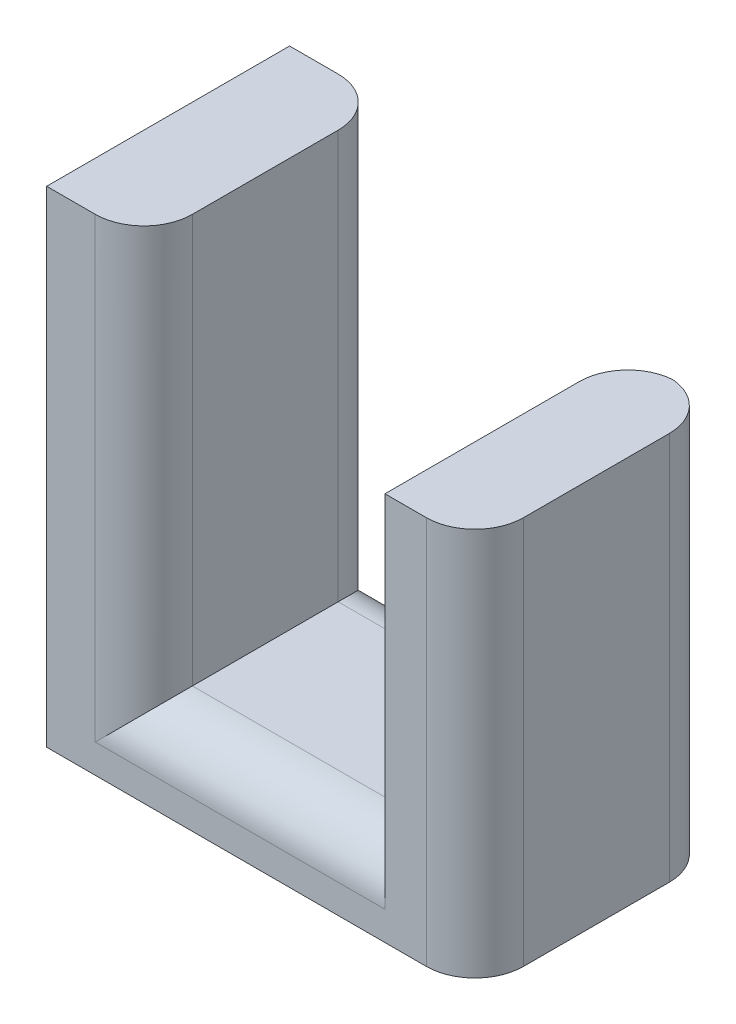
ISO-10303-21;
HEADER;
FILE_DESCRIPTION(('STEP AP214'),'2;1');
FILE_NAME('part.step','',(''),(''),'','','');
FILE_SCHEMA(('AUTOMOTIVE_DESIGN { 1 0 10303 214 1 1 1 1 }'));
ENDSEC;
DATA;
#1=APPLICATION_CONTEXT('core data for automotive mechanical design processes');
#2=APPLICATION_PROTOCOL_DEFINITION('international standard','automotive_design',2000,#1);
#3=PRODUCT_CONTEXT('',#1,'mechanical');
#4=PRODUCT('Part','Part','',(#3));
#5=PRODUCT_RELATED_PRODUCT_CATEGORY('part','',(#4));
#6=PRODUCT_DEFINITION_FORMATION('','',#4);
#7=PRODUCT_DEFINITION_CONTEXT('part definition',#1,'design');
#8=PRODUCT_DEFINITION('design','',#6,#7);
#9=PRODUCT_DEFINITION_SHAPE('','',#8);
#10=(LENGTH_UNIT() NAMED_UNIT(*) SI_UNIT(.MILLI.,.METRE.));
#11=(NAMED_UNIT(*) PLANE_ANGLE_UNIT() SI_UNIT($,.RADIAN.));
#12=(NAMED_UNIT(*) SI_UNIT($,.STERADIAN.) SOLID_ANGLE_UNIT());
#13=UNCERTAINTY_MEASURE_WITH_UNIT(LENGTH_MEASURE(1.E-05),#10,'distance_accuracy_value','');
#14=(GEOMETRIC_REPRESENTATION_CONTEXT(3) GLOBAL_UNCERTAINTY_ASSIGNED_CONTEXT((#13)) GLOBAL_UNIT_ASSIGNED_CONTEXT((#10,
#11,#12)) REPRESENTATION_CONTEXT('',''));
#15=CARTESIAN_POINT('',(0.,0.,0.));
#16=DIRECTION('',(0.,0.,1.));
#17=DIRECTION('',(1.,0.,0.));
#18=AXIS2_PLACEMENT_3D('',#15,#16,#17);
#19=CARTESIAN_POINT('',(12.962962962963,-13.0555555555556,25.));
#20=DIRECTION('',(-1.,0.,0.));
#21=DIRECTION('',(0.,-1.,0.));
#22=AXIS2_PLACEMENT_3D('',#19,#20,#21);
#23=PLANE('',#22);
#24=DIRECTION('',(0.,0.,-1.));
#25=VECTOR('',#24,1.);
#26=CARTESIAN_POINT('',(12.962962962963,28.9814814814815,25.));
#27=LINE('',#26,#25);
#28=CARTESIAN_POINT('',(12.962962962963,28.9814814814815,20.));
#29=VERTEX_POINT('',#28);
#30=CARTESIAN_POINT('',(12.962962962963,28.9814814814815,5.));
#31=VERTEX_POINT('',#30);
#32=EDGE_CURVE('E151',#29,#31,#27,.T.);
#33=ORIENTED_EDGE('',*,*,#32,.F.);
#34=DIRECTION('',(0.,1.,0.));
#35=VECTOR('',#34,1.);
#36=CARTESIAN_POINT('',(12.962962962963,-13.0555555555556,20.));
#37=LINE('',#36,#35);
#38=CARTESIAN_POINT('',(12.962962962963,-13.0555555555556,20.));
#39=VERTEX_POINT('',#38);
#40=EDGE_CURVE('E43',#29,#39,#37,.F.);
#41=ORIENTED_EDGE('',*,*,#40,.T.);
#42=DIRECTION('',(0.,0.,-1.));
#43=VECTOR('',#42,1.);
#44=CARTESIAN_POINT('',(12.962962962963,-13.0555555555556,25.));
#45=LINE('',#44,#43);
#46=CARTESIAN_POINT('',(12.962962962963,-13.0555555555556,5.));
#47=VERTEX_POINT('',#46);
#48=EDGE_CURVE('E166',#39,#47,#45,.T.);
#49=ORIENTED_EDGE('',*,*,#48,.T.);
#50=DIRECTION('',(0.,1.,0.));
#51=VECTOR('',#50,1.);
#52=CARTESIAN_POINT('',(12.962962962963,-13.0555555555556,5.));
#53=LINE('',#52,#51);
#54=EDGE_CURVE('E51',#47,#31,#53,.T.);
#55=ORIENTED_EDGE('',*,*,#54,.T.);
#56=EDGE_LOOP('',(#33,#41,#49,#55));
#57=FACE_BOUND('',#56,.T.);
#58=ADVANCED_FACE('F33',(#57),#23,.F.);
#59=CARTESIAN_POINT('',(12.962962962963,28.9814814814815,25.));
#60=DIRECTION('',(0.,-1.,0.));
#61=DIRECTION('',(0.,0.,-1.));
#62=AXIS2_PLACEMENT_3D('',#59,#60,#61);
#63=PLANE('',#62);
#64=DIRECTION('',(-1.,0.,0.));
#65=VECTOR('',#64,1.);
#66=CARTESIAN_POINT('',(12.962962962963,28.9814814814815,25.));
#67=LINE('',#66,#65);
#68=CARTESIAN_POINT('',(7.96296296296297,28.9814814814815,25.));
#69=VERTEX_POINT('',#68);
#70=CARTESIAN_POINT('',(2.96296296296297,28.9814814814815,25.));
#71=VERTEX_POINT('',#70);
#72=EDGE_CURVE('E129',#69,#71,#67,.T.);
#73=ORIENTED_EDGE('',*,*,#72,.F.);
#74=CARTESIAN_POINT('',(7.96296296296297,28.9814814814815,20.));
#75=DIRECTION('',(0.,-1.,0.));
#76=DIRECTION('',(0.,0.,-1.));
#77=AXIS2_PLACEMENT_3D('',#74,#75,#76);
#78=CIRCLE('',#77,5.);
#79=EDGE_CURVE('E223',#69,#29,#78,.F.);
#80=ORIENTED_EDGE('',*,*,#79,.T.);
#81=ORIENTED_EDGE('',*,*,#32,.T.);
#82=CARTESIAN_POINT('',(7.96296296296297,28.9814814814815,5.));
#83=DIRECTION('',(0.,-1.,0.));
#84=DIRECTION('',(0.,0.,-1.));
#85=AXIS2_PLACEMENT_3D('',#82,#83,#84);
#86=CIRCLE('',#85,5.);
#87=CARTESIAN_POINT('',(7.96296296296297,28.9814814814815,0.));
#88=VERTEX_POINT('',#87);
#89=EDGE_CURVE('E221',#31,#88,#86,.F.);
#90=ORIENTED_EDGE('',*,*,#89,.T.);
#91=DIRECTION('',(-1.,0.,0.));
#92=VECTOR('',#91,1.);
#93=CARTESIAN_POINT('',(12.962962962963,28.9814814814815,0.));
#94=LINE('',#93,#92);
#95=CARTESIAN_POINT('',(2.96296296296297,28.9814814814815,0.));
#96=VERTEX_POINT('',#95);
#97=EDGE_CURVE('E147',#88,#96,#94,.T.);
#98=ORIENTED_EDGE('',*,*,#97,.T.);
#99=DIRECTION('',(0.,0.,-1.));
#100=VECTOR('',#99,1.);
#101=CARTESIAN_POINT('',(2.96296296296297,28.9814814814815,25.));
#102=LINE('',#101,#100);
#103=EDGE_CURVE('E144',#71,#96,#102,.T.);
#104=ORIENTED_EDGE('',*,*,#103,.F.);
#105=EDGE_LOOP('',(#73,#80,#81,#90,#98,#104));
#106=FACE_BOUND('',#105,.T.);
#107=ADVANCED_FACE('F145',(#106),#63,.F.);
#108=CARTESIAN_POINT('',(2.96296296296297,28.9814814814815,25.));
#109=DIRECTION('',(1.,0.,0.));
#110=DIRECTION('',(0.,1.,0.));
#111=AXIS2_PLACEMENT_3D('',#108,#109,#110);
#112=PLANE('',#111);
#113=CARTESIAN_POINT('',(2.96296296296297,17.1397084282905,12.5));
#114=DIRECTION('',(-1.,0.,0.));
#115=DIRECTION('',(0.,-1.,0.));
#116=AXIS2_PLACEMENT_3D('',#113,#114,#115);
#117=CIRCLE('',#116,9.75);
#118=CARTESIAN_POINT('',(2.96296296296297,7.38970842829047,12.5));
#119=VERTEX_POINT('',#118);
#120=EDGE_CURVE('E236',#119,#119,#117,.T.);
#121=ORIENTED_EDGE('',*,*,#120,.F.);
#122=EDGE_LOOP('',(#121));
#123=FACE_BOUND('',#122,.T.);
#124=DIRECTION('',(0.,-1.,0.));
#125=VECTOR('',#124,1.);
#126=CARTESIAN_POINT('',(2.96296296296297,28.9814814814815,0.));
#127=LINE('',#126,#125);
#128=CARTESIAN_POINT('',(2.96296296296297,-21.0185185185185,0.));
#129=VERTEX_POINT('',#128);
#130=EDGE_CURVE('E168',#96,#129,#127,.T.);
#131=ORIENTED_EDGE('',*,*,#130,.T.);
#132=DIRECTION('',(0.,0.,-1.));
#133=VECTOR('',#132,1.);
#134=CARTESIAN_POINT('',(2.96296296296297,-21.0185185185185,25.));
#135=LINE('',#134,#133);
#136=CARTESIAN_POINT('',(2.96296296296297,-21.0185185185185,25.));
#137=VERTEX_POINT('',#136);
#138=EDGE_CURVE('E152',#137,#129,#135,.T.);
#139=ORIENTED_EDGE('',*,*,#138,.F.);
#140=DIRECTION('',(0.,-1.,0.));
#141=VECTOR('',#140,1.);
#142=CARTESIAN_POINT('',(2.96296296296297,28.9814814814815,25.));
#143=LINE('',#142,#141);
#144=EDGE_CURVE('E134',#71,#137,#143,.T.);
#145=ORIENTED_EDGE('',*,*,#144,.F.);
#146=ORIENTED_EDGE('',*,*,#103,.T.);
#147=EDGE_LOOP('',(#131,#139,#145,#146));
#148=FACE_BOUND('',#147,.T.);
#149=ADVANCED_FACE('F154',(#123,#148),#112,.F.);
#150=CARTESIAN_POINT('',(12.962962962963,-21.0185185185185,25.));
#151=DIRECTION('',(0.,1.,0.));
#152=DIRECTION('',(0.,0.,1.));
#153=AXIS2_PLACEMENT_3D('',#150,#151,#152);
#154=PLANE('',#153);
#155=DIRECTION('',(0.,0.,-1.));
#156=VECTOR('',#155,1.);
#157=CARTESIAN_POINT('',(47.037037037037,-21.0185185185185,25.));
#158=LINE('',#157,#156);
#159=CARTESIAN_POINT('',(47.037037037037,-21.0185185185185,20.));
#160=VERTEX_POINT('',#159);
#161=CARTESIAN_POINT('',(47.037037037037,-21.0185185185185,5.));
#162=VERTEX_POINT('',#161);
#163=EDGE_CURVE('E183',#160,#162,#158,.T.);
#164=ORIENTED_EDGE('',*,*,#163,.F.);
#165=CARTESIAN_POINT('',(42.037037037037,-21.0185185185185,20.));
#166=DIRECTION('',(0.,1.,0.));
#167=DIRECTION('',(0.,0.,1.));
#168=AXIS2_PLACEMENT_3D('',#165,#166,#167);
#169=CIRCLE('',#168,5.);
#170=CARTESIAN_POINT('',(42.037037037037,-21.0185185185185,25.));
#171=VERTEX_POINT('',#170);
#172=EDGE_CURVE('E217',#160,#171,#169,.F.);
#173=ORIENTED_EDGE('',*,*,#172,.T.);
#174=DIRECTION('',(1.,0.,0.));
#175=VECTOR('',#174,1.);
#176=CARTESIAN_POINT('',(12.962962962963,-21.0185185185185,25.));
#177=LINE('',#176,#175);
#178=EDGE_CURVE('E157',#137,#171,#177,.T.);
#179=ORIENTED_EDGE('',*,*,#178,.F.);
#180=ORIENTED_EDGE('',*,*,#138,.T.);
#181=DIRECTION('',(1.,0.,0.));
#182=VECTOR('',#181,1.);
#183=CARTESIAN_POINT('',(12.962962962963,-21.0185185185185,0.));
#184=LINE('',#183,#182);
#185=CARTESIAN_POINT('',(42.037037037037,-21.0185185185185,0.));
#186=VERTEX_POINT('',#185);
#187=EDGE_CURVE('E141',#129,#186,#184,.T.);
#188=ORIENTED_EDGE('',*,*,#187,.T.);
#189=CARTESIAN_POINT('',(42.037037037037,-21.0185185185185,5.));
#190=DIRECTION('',(0.,1.,0.));
#191=DIRECTION('',(0.,0.,1.));
#192=AXIS2_PLACEMENT_3D('',#189,#190,#191);
#193=CIRCLE('',#192,5.);
#194=EDGE_CURVE('E215',#186,#162,#193,.F.);
#195=ORIENTED_EDGE('',*,*,#194,.T.);
#196=EDGE_LOOP('',(#164,#173,#179,#180,#188,#195));
#197=FACE_BOUND('',#196,.T.);
#198=ADVANCED_FACE('F314',(#197),#154,.F.);
#199=CARTESIAN_POINT('',(47.037037037037,-21.0185185185185,25.));
#200=DIRECTION('',(-1.,0.,0.));
#201=DIRECTION('',(0.,0.,1.));
#202=AXIS2_PLACEMENT_3D('',#199,#200,#201);
#203=PLANE('',#202);
#204=DIRECTION('',(0.,0.,-1.));
#205=VECTOR('',#204,1.);
#206=CARTESIAN_POINT('',(47.037037037037,18.9814814814815,25.));
#207=LINE('',#206,#205);
#208=CARTESIAN_POINT('',(47.037037037037,18.9814814814815,20.));
#209=VERTEX_POINT('',#208);
#210=CARTESIAN_POINT('',(47.037037037037,18.9814814814815,5.));
#211=VERTEX_POINT('',#210);
#212=EDGE_CURVE('E180',#209,#211,#207,.T.);
#213=ORIENTED_EDGE('',*,*,#212,.F.);
#214=DIRECTION('',(0.,1.,0.));
#215=VECTOR('',#214,1.);
#216=CARTESIAN_POINT('',(47.037037037037,-21.0185185185185,20.));
#217=LINE('',#216,#215);
#218=EDGE_CURVE('E213',#209,#160,#217,.F.);
#219=ORIENTED_EDGE('',*,*,#218,.T.);
#220=ORIENTED_EDGE('',*,*,#163,.T.);
#221=DIRECTION('',(0.,1.,0.));
#222=VECTOR('',#221,1.);
#223=CARTESIAN_POINT('',(47.037037037037,-21.0185185185185,5.));
#224=LINE('',#223,#222);
#225=EDGE_CURVE('E211',#162,#211,#224,.T.);
#226=ORIENTED_EDGE('',*,*,#225,.T.);
#227=EDGE_LOOP('',(#213,#219,#220,#226));
#228=FACE_BOUND('',#227,.T.);
#229=ADVANCED_FACE('F327',(#228),#203,.F.);
#230=CARTESIAN_POINT('',(37.7777777777778,18.9814814814815,25.));
#231=DIRECTION('',(0.,-1.,0.));
#232=DIRECTION('',(0.,0.,-1.));
#233=AXIS2_PLACEMENT_3D('',#230,#231,#232);
#234=PLANE('',#233);
#235=DIRECTION('',(-1.,0.,0.));
#236=VECTOR('',#235,1.);
#237=CARTESIAN_POINT('',(37.7777777777778,18.9814814814815,25.));
#238=LINE('',#237,#236);
#239=CARTESIAN_POINT('',(42.037037037037,18.9814814814815,25.));
#240=VERTEX_POINT('',#239);
#241=CARTESIAN_POINT('',(37.7777777777778,18.9814814814815,25.));
#242=VERTEX_POINT('',#241);
#243=EDGE_CURVE('E159',#240,#242,#238,.T.);
#244=ORIENTED_EDGE('',*,*,#243,.F.);
#245=CARTESIAN_POINT('',(42.037037037037,18.9814814814815,20.));
#246=DIRECTION('',(0.,-1.,0.));
#247=DIRECTION('',(0.,0.,-1.));
#248=AXIS2_PLACEMENT_3D('',#245,#246,#247);
#249=CIRCLE('',#248,5.);
#250=EDGE_CURVE('E209',#240,#209,#249,.F.);
#251=ORIENTED_EDGE('',*,*,#250,.T.);
#252=ORIENTED_EDGE('',*,*,#212,.T.);
#253=CARTESIAN_POINT('',(42.037037037037,18.9814814814815,5.));
#254=DIRECTION('',(0.,-1.,0.));
#255=DIRECTION('',(0.,0.,-1.));
#256=AXIS2_PLACEMENT_3D('',#253,#254,#255);
#257=CIRCLE('',#256,5.);
#258=CARTESIAN_POINT('',(42.4074074074074,18.9814814814815,0.0137362896902738));
#259=VERTEX_POINT('',#258);
#260=EDGE_CURVE('E207',#211,#259,#257,.F.);
#261=ORIENTED_EDGE('',*,*,#260,.T.);
#262=CARTESIAN_POINT('',(42.7777777777778,18.9814814814815,5.));
#263=DIRECTION('',(0.,-1.,0.));
#264=DIRECTION('',(0.,0.,-1.));
#265=AXIS2_PLACEMENT_3D('',#262,#263,#264);
#266=CIRCLE('',#265,5.);
#267=CARTESIAN_POINT('',(37.7777777777778,18.9814814814815,5.));
#268=VERTEX_POINT('',#267);
#269=EDGE_CURVE('E205',#259,#268,#266,.F.);
#270=ORIENTED_EDGE('',*,*,#269,.T.);
#271=DIRECTION('',(0.,0.,-1.));
#272=VECTOR('',#271,1.);
#273=CARTESIAN_POINT('',(37.7777777777778,18.9814814814815,25.));
#274=LINE('',#273,#272);
#275=EDGE_CURVE('E177',#242,#268,#274,.T.);
#276=ORIENTED_EDGE('',*,*,#275,.F.);
#277=EDGE_LOOP('',(#244,#251,#252,#261,#270,#276));
#278=FACE_BOUND('',#277,.T.);
#279=ADVANCED_FACE('F323',(#278),#234,.F.);
#280=CARTESIAN_POINT('',(37.7777777777778,18.9814814814815,25.));
#281=DIRECTION('',(1.,0.,0.));
#282=DIRECTION('',(0.,0.,-1.));
#283=AXIS2_PLACEMENT_3D('',#280,#281,#282);
#284=PLANE('',#283);
#285=ORIENTED_EDGE('',*,*,#275,.T.);
#286=DIRECTION('',(0.,-1.,0.));
#287=VECTOR('',#286,1.);
#288=CARTESIAN_POINT('',(37.7777777777778,18.9814814814815,5.));
#289=LINE('',#288,#287);
#290=CARTESIAN_POINT('',(37.7777777777778,-13.0555555555556,5.));
#291=VERTEX_POINT('',#290);
#292=EDGE_CURVE('E219',#268,#291,#289,.T.);
#293=ORIENTED_EDGE('',*,*,#292,.T.);
#294=DIRECTION('',(0.,0.,-1.));
#295=VECTOR('',#294,1.);
#296=CARTESIAN_POINT('',(37.7777777777778,-13.0555555555556,25.));
#297=LINE('',#296,#295);
#298=CARTESIAN_POINT('',(37.7777777777778,-13.0555555555556,20.));
#299=VERTEX_POINT('',#298);
#300=EDGE_CURVE('E174',#299,#291,#297,.T.);
#301=ORIENTED_EDGE('',*,*,#300,.F.);
#302=CARTESIAN_POINT('',(37.7777777777778,-18.0555555555556,20.));
#303=DIRECTION('',(1.,0.,0.));
#304=DIRECTION('',(0.,0.,-1.));
#305=AXIS2_PLACEMENT_3D('',#302,#303,#304);
#306=CIRCLE('',#305,5.);
#307=CARTESIAN_POINT('',(37.7777777777778,-18.0555555555556,25.));
#308=VERTEX_POINT('',#307);
#309=EDGE_CURVE('E11',#299,#308,#306,.T.);
#310=ORIENTED_EDGE('',*,*,#309,.T.);
#311=DIRECTION('',(0.,-1.,0.));
#312=VECTOR('',#311,1.);
#313=CARTESIAN_POINT('',(37.7777777777778,18.9814814814815,25.));
#314=LINE('',#313,#312);
#315=EDGE_CURVE('E164',#242,#308,#314,.T.);
#316=ORIENTED_EDGE('',*,*,#315,.F.);
#317=EDGE_LOOP('',(#285,#293,#301,#310,#316));
#318=FACE_BOUND('',#317,.T.);
#319=ADVANCED_FACE('F307',(#318),#284,.F.);
#320=CARTESIAN_POINT('',(37.7777777777778,-13.0555555555556,25.));
#321=DIRECTION('',(0.,-1.,0.));
#322=DIRECTION('',(0.,0.,-1.));
#323=AXIS2_PLACEMENT_3D('',#320,#321,#322);
#324=PLANE('',#323);
#325=ORIENTED_EDGE('',*,*,#300,.T.);
#326=DIRECTION('',(-1.,0.,0.));
#327=VECTOR('',#326,1.);
#328=CARTESIAN_POINT('',(37.7777777777778,-13.0555555555556,5.));
#329=LINE('',#328,#327);
#330=EDGE_CURVE('E190',#291,#47,#329,.T.);
#331=ORIENTED_EDGE('',*,*,#330,.T.);
#332=ORIENTED_EDGE('',*,*,#48,.F.);
#333=DIRECTION('',(-1.,0.,0.));
#334=VECTOR('',#333,1.);
#335=CARTESIAN_POINT('',(37.7777777777778,-13.0555555555556,20.));
#336=LINE('',#335,#334);
#337=EDGE_CURVE('E188',#39,#299,#336,.F.);
#338=ORIENTED_EDGE('',*,*,#337,.T.);
#339=EDGE_LOOP('',(#325,#331,#332,#338));
#340=FACE_BOUND('',#339,.T.);
#341=ADVANCED_FACE('F300',(#340),#324,.F.);
#342=CARTESIAN_POINT('',(0.,0.,25.));
#343=DIRECTION('',(0.,0.,1.));
#344=DIRECTION('',(1.,0.,0.));
#345=AXIS2_PLACEMENT_3D('',#342,#343,#344);
#346=PLANE('',#345);
#347=ORIENTED_EDGE('',*,*,#178,.T.);
#348=DIRECTION('',(0.,1.,0.));
#349=VECTOR('',#348,1.);
#350=CARTESIAN_POINT('',(42.037037037037,18.9814814814815,25.));
#351=LINE('',#350,#349);
#352=EDGE_CURVE('E202',#171,#240,#351,.T.);
#353=ORIENTED_EDGE('',*,*,#352,.T.);
#354=ORIENTED_EDGE('',*,*,#243,.T.);
#355=ORIENTED_EDGE('',*,*,#315,.T.);
#356=DIRECTION('',(-1.,0.,0.));
#357=VECTOR('',#356,1.);
#358=CARTESIAN_POINT('',(12.962962962963,-18.0555555555556,25.));
#359=LINE('',#358,#357);
#360=CARTESIAN_POINT('',(7.96296296296297,-18.0555555555556,25.));
#361=VERTEX_POINT('',#360);
#362=EDGE_CURVE('E200',#308,#361,#359,.T.);
#363=ORIENTED_EDGE('',*,*,#362,.T.);
#364=DIRECTION('',(0.,1.,0.));
#365=VECTOR('',#364,1.);
#366=CARTESIAN_POINT('',(7.96296296296297,28.9814814814815,25.));
#367=LINE('',#366,#365);
#368=EDGE_CURVE('E138',#361,#69,#367,.T.);
#369=ORIENTED_EDGE('',*,*,#368,.T.);
#370=ORIENTED_EDGE('',*,*,#72,.T.);
#371=ORIENTED_EDGE('',*,*,#144,.T.);
#372=EDGE_LOOP('',(#347,#353,#354,#355,#363,#369,#370,#371));
#373=FACE_BOUND('',#372,.T.);
#374=ADVANCED_FACE('F132',(#373),#346,.T.);
#375=CARTESIAN_POINT('',(0.,0.,0.));
#376=DIRECTION('',(0.,0.,1.));
#377=DIRECTION('',(1.,0.,0.));
#378=AXIS2_PLACEMENT_3D('',#375,#376,#377);
#379=PLANE('',#378);
#380=DIRECTION('',(-1.,0.,0.));
#381=VECTOR('',#380,1.);
#382=CARTESIAN_POINT('',(0.,-18.0555555555556,0.));
#383=LINE('',#382,#381);
#384=CARTESIAN_POINT('',(7.96296296296297,-18.0555555555556,0.));
#385=VERTEX_POINT('',#384);
#386=CARTESIAN_POINT('',(42.037037037037,-18.0555555555556,0.));
#387=VERTEX_POINT('',#386);
#388=EDGE_CURVE('E195',#385,#387,#383,.F.);
#389=ORIENTED_EDGE('',*,*,#388,.T.);
#390=DIRECTION('',(0.,1.,0.));
#391=VECTOR('',#390,1.);
#392=CARTESIAN_POINT('',(42.037037037037,0.,0.));
#393=LINE('',#392,#391);
#394=EDGE_CURVE('E197',#387,#186,#393,.F.);
#395=ORIENTED_EDGE('',*,*,#394,.T.);
#396=ORIENTED_EDGE('',*,*,#187,.F.);
#397=ORIENTED_EDGE('',*,*,#130,.F.);
#398=ORIENTED_EDGE('',*,*,#97,.F.);
#399=DIRECTION('',(0.,1.,0.));
#400=VECTOR('',#399,1.);
#401=CARTESIAN_POINT('',(7.96296296296297,0.,0.));
#402=LINE('',#401,#400);
#403=EDGE_CURVE('E193',#88,#385,#402,.F.);
#404=ORIENTED_EDGE('',*,*,#403,.T.);
#405=EDGE_LOOP('',(#389,#395,#396,#397,#398,#404));
#406=FACE_BOUND('',#405,.T.);
#407=ADVANCED_FACE('F253',(#406),#379,.F.);
#408=CARTESIAN_POINT('',(7.96296296296297,17.1397084282905,12.5));
#409=DIRECTION('',(-1.,0.,0.));
#410=DIRECTION('',(0.,-1.,0.));
#411=AXIS2_PLACEMENT_3D('',#408,#409,#410);
#412=CYLINDRICAL_SURFACE('',#411,9.75);
#413=CARTESIAN_POINT('',(7.96296296296297,17.1397084282905,12.5));
#414=DIRECTION('',(-1.,0.,0.));
#415=DIRECTION('',(0.,-1.,0.));
#416=AXIS2_PLACEMENT_3D('',#413,#414,#415);
#417=CIRCLE('',#416,9.75);
#418=CARTESIAN_POINT('',(7.96296296296297,7.38970842829047,12.5));
#419=VERTEX_POINT('',#418);
#420=EDGE_CURVE('E169',#419,#419,#417,.T.);
#421=ORIENTED_EDGE('',*,*,#420,.F.);
#422=EDGE_LOOP('',(#421));
#423=FACE_BOUND('',#422,.T.);
#424=ORIENTED_EDGE('',*,*,#120,.T.);
#425=EDGE_LOOP('',(#424));
#426=FACE_BOUND('',#425,.T.);
#427=ADVANCED_FACE('F251',(#423,#426),#412,.F.);
#428=CARTESIAN_POINT('',(7.96296296296297,17.1397084282905,12.5));
#429=DIRECTION('',(-1.,0.,0.));
#430=DIRECTION('',(0.,-1.,0.));
#431=AXIS2_PLACEMENT_3D('',#428,#429,#430);
#432=PLANE('',#431);
#433=ORIENTED_EDGE('',*,*,#420,.T.);
#434=EDGE_LOOP('',(#433));
#435=FACE_BOUND('',#434,.T.);
#436=ADVANCED_FACE('F249',(#435),#432,.T.);
#437=CARTESIAN_POINT('',(42.037037037037,-21.0185185185185,5.));
#438=DIRECTION('',(0.,1.,0.));
#439=DIRECTION('',(0.,0.,1.));
#440=AXIS2_PLACEMENT_3D('',#437,#438,#439);
#441=CYLINDRICAL_SURFACE('',#440,5.);
#442=DIRECTION('',(0.,1.,0.));
#443=VECTOR('',#442,1.);
#444=CARTESIAN_POINT('',(42.4074074074074,-1.01851851851853,0.0137362896902738));
#445=LINE('',#444,#443);
#446=CARTESIAN_POINT('',(42.4074074074074,-17.6851851851852,0.0137362896902747));
#447=VERTEX_POINT('',#446);
#448=EDGE_CURVE('E234',#259,#447,#445,.F.);
#449=ORIENTED_EDGE('',*,*,#448,.F.);
#450=ORIENTED_EDGE('',*,*,#260,.F.);
#451=ORIENTED_EDGE('',*,*,#225,.F.);
#452=ORIENTED_EDGE('',*,*,#194,.F.);
#453=ORIENTED_EDGE('',*,*,#394,.F.);
#454=CARTESIAN_POINT('',(42.037037037037,-18.0555555555556,5.));
#455=DIRECTION('',(-0.707106781186547,0.707106781186547,0.));
#456=DIRECTION('',(-0.707106781186547,-0.707106781186547,0.));
#457=AXIS2_PLACEMENT_3D('',#454,#455,#456);
#458=ELLIPSE('',#457,7.07106781186547,5.);
#459=EDGE_CURVE('E232',#447,#387,#458,.T.);
#460=ORIENTED_EDGE('',*,*,#459,.F.);
#461=EDGE_LOOP('',(#449,#450,#451,#452,#453,#460));
#462=FACE_BOUND('',#461,.T.);
#463=ADVANCED_FACE('F259',(#462),#441,.T.);
#464=CARTESIAN_POINT('',(42.7777777777778,18.9814814814815,5.));
#465=DIRECTION('',(0.,-1.,0.));
#466=DIRECTION('',(0.,0.,-1.));
#467=AXIS2_PLACEMENT_3D('',#464,#465,#466);
#468=CYLINDRICAL_SURFACE('',#467,5.);
#469=ORIENTED_EDGE('',*,*,#269,.F.);
#470=ORIENTED_EDGE('',*,*,#448,.T.);
#471=CARTESIAN_POINT('',(42.7777777777778,-18.0555555555556,5.));
#472=DIRECTION('',(-0.707106781186547,-0.707106781186547,0.));
#473=DIRECTION('',(-0.707106781186547,0.707106781186547,0.));
#474=AXIS2_PLACEMENT_3D('',#471,#472,#473);
#475=ELLIPSE('',#474,7.07106781186547,5.);
#476=EDGE_CURVE('E229',#291,#447,#475,.T.);
#477=ORIENTED_EDGE('',*,*,#476,.F.);
#478=ORIENTED_EDGE('',*,*,#292,.F.);
#479=EDGE_LOOP('',(#469,#470,#477,#478));
#480=FACE_BOUND('',#479,.T.);
#481=ADVANCED_FACE('F280',(#480),#468,.T.);
#482=CARTESIAN_POINT('',(7.96296296296297,-13.0555555555556,5.));
#483=DIRECTION('',(0.,1.,0.));
#484=DIRECTION('',(-1.,0.,0.));
#485=AXIS2_PLACEMENT_3D('',#482,#483,#484);
#486=CYLINDRICAL_SURFACE('',#485,5.);
#487=ORIENTED_EDGE('',*,*,#89,.F.);
#488=ORIENTED_EDGE('',*,*,#54,.F.);
#489=CARTESIAN_POINT('',(7.96296296296297,-18.0555555555556,5.));
#490=DIRECTION('',(-0.707106781186547,0.707106781186547,0.));
#491=DIRECTION('',(-0.707106781186547,-0.707106781186547,0.));
#492=AXIS2_PLACEMENT_3D('',#489,#490,#491);
#493=ELLIPSE('',#492,7.07106781186547,5.);
#494=EDGE_CURVE('E227',#385,#47,#493,.F.);
#495=ORIENTED_EDGE('',*,*,#494,.F.);
#496=ORIENTED_EDGE('',*,*,#403,.F.);
#497=EDGE_LOOP('',(#487,#488,#495,#496));
#498=FACE_BOUND('',#497,.T.);
#499=ADVANCED_FACE('F276',(#498),#486,.T.);
#500=CARTESIAN_POINT('',(37.7777777777778,-18.0555555555556,5.));
#501=DIRECTION('',(-1.,0.,0.));
#502=DIRECTION('',(0.,0.,1.));
#503=AXIS2_PLACEMENT_3D('',#500,#501,#502);
#504=CYLINDRICAL_SURFACE('',#503,5.);
#505=ORIENTED_EDGE('',*,*,#459,.T.);
#506=ORIENTED_EDGE('',*,*,#388,.F.);
#507=ORIENTED_EDGE('',*,*,#494,.T.);
#508=ORIENTED_EDGE('',*,*,#330,.F.);
#509=ORIENTED_EDGE('',*,*,#476,.T.);
#510=EDGE_LOOP('',(#505,#506,#507,#508,#509));
#511=FACE_BOUND('',#510,.T.);
#512=ADVANCED_FACE('F272',(#511),#504,.T.);
#513=CARTESIAN_POINT('',(7.96296296296297,0.,20.));
#514=DIRECTION('',(0.,-1.,0.));
#515=DIRECTION('',(1.,0.,0.));
#516=AXIS2_PLACEMENT_3D('',#513,#514,#515);
#517=CYLINDRICAL_SURFACE('',#516,5.);
#518=ORIENTED_EDGE('',*,*,#79,.F.);
#519=ORIENTED_EDGE('',*,*,#368,.F.);
#520=CARTESIAN_POINT('',(7.96296296296297,-18.0555555555556,20.));
#521=DIRECTION('',(0.707106781186547,-0.707106781186547,0.));
#522=DIRECTION('',(0.707106781186547,0.707106781186547,0.));
#523=AXIS2_PLACEMENT_3D('',#520,#521,#522);
#524=ELLIPSE('',#523,7.07106781186547,5.);
#525=EDGE_CURVE('E37',#39,#361,#524,.T.);
#526=ORIENTED_EDGE('',*,*,#525,.F.);
#527=ORIENTED_EDGE('',*,*,#40,.F.);
#528=EDGE_LOOP('',(#518,#519,#526,#527));
#529=FACE_BOUND('',#528,.T.);
#530=ADVANCED_FACE('F275',(#529),#517,.T.);
#531=CARTESIAN_POINT('',(0.,-18.0555555555556,20.));
#532=DIRECTION('',(1.,0.,0.));
#533=DIRECTION('',(0.,0.,-1.));
#534=AXIS2_PLACEMENT_3D('',#531,#532,#533);
#535=CYLINDRICAL_SURFACE('',#534,5.);
#536=ORIENTED_EDGE('',*,*,#309,.F.);
#537=ORIENTED_EDGE('',*,*,#337,.F.);
#538=ORIENTED_EDGE('',*,*,#525,.T.);
#539=ORIENTED_EDGE('',*,*,#362,.F.);
#540=EDGE_LOOP('',(#536,#537,#538,#539));
#541=FACE_BOUND('',#540,.T.);
#542=ADVANCED_FACE('F287',(#541),#535,.T.);
#543=CARTESIAN_POINT('',(42.037037037037,0.,20.));
#544=DIRECTION('',(0.,-1.,0.));
#545=DIRECTION('',(0.,0.,-1.));
#546=AXIS2_PLACEMENT_3D('',#543,#544,#545);
#547=CYLINDRICAL_SURFACE('',#546,5.);
#548=ORIENTED_EDGE('',*,*,#172,.F.);
#549=ORIENTED_EDGE('',*,*,#218,.F.);
#550=ORIENTED_EDGE('',*,*,#250,.F.);
#551=ORIENTED_EDGE('',*,*,#352,.F.);
#552=EDGE_LOOP('',(#548,#549,#550,#551));
#553=FACE_BOUND('',#552,.T.);
#554=ADVANCED_FACE('F35',(#553),#547,.T.);
#555=CLOSED_SHELL('',(#58,#107,#149,#198,#229,#279,#319,#341,#374,#407,#427,#436,#463,#481,#499,
#512,#530,#542,#554));
#556=MANIFOLD_SOLID_BREP('B2',#555);
#557=ADVANCED_BREP_SHAPE_REPRESENTATION('',(#18,#556),#14);
#558=SHAPE_DEFINITION_REPRESENTATION(#9,#557);
ENDSEC;
END-ISO-10303-21;
